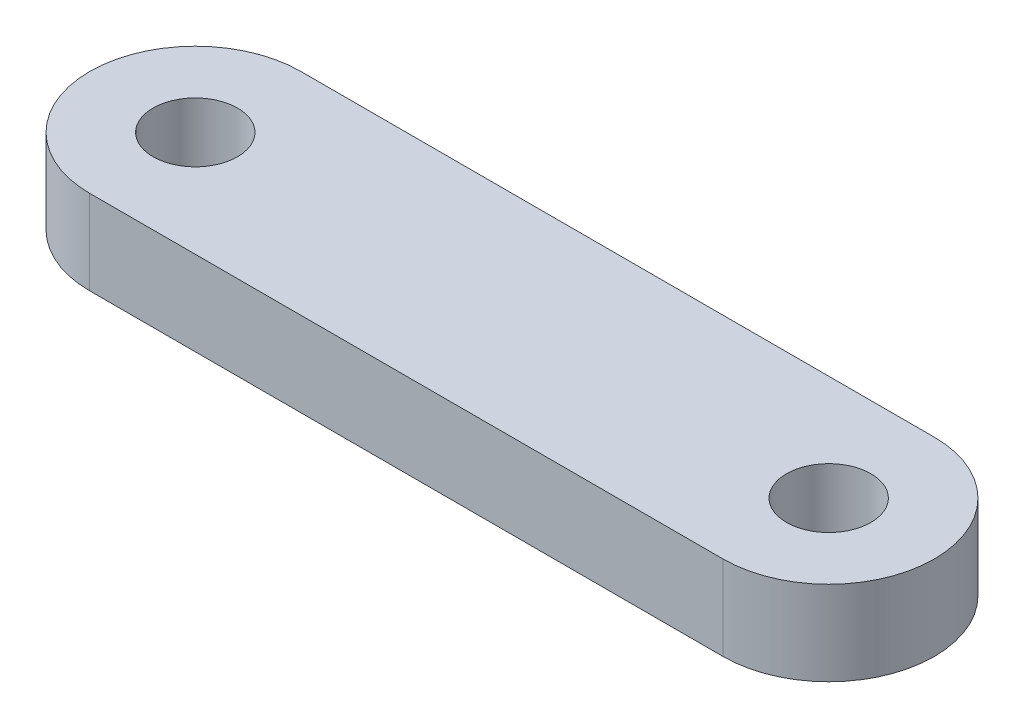
ISO-10303-21;
HEADER;
FILE_DESCRIPTION(('STEP AP214'),'2;1');
FILE_NAME('part.step','',(''),(''),'','','');
FILE_SCHEMA(('AUTOMOTIVE_DESIGN { 1 0 10303 214 1 1 1 1 }'));
ENDSEC;
DATA;
#1=APPLICATION_CONTEXT('core data for automotive mechanical design processes');
#2=APPLICATION_PROTOCOL_DEFINITION('international standard','automotive_design',2000,#1);
#3=PRODUCT_CONTEXT('',#1,'mechanical');
#4=PRODUCT('Part','Part','',(#3));
#5=PRODUCT_RELATED_PRODUCT_CATEGORY('part','',(#4));
#6=PRODUCT_DEFINITION_FORMATION('','',#4);
#7=PRODUCT_DEFINITION_CONTEXT('part definition',#1,'design');
#8=PRODUCT_DEFINITION('design','',#6,#7);
#9=PRODUCT_DEFINITION_SHAPE('','',#8);
#10=(LENGTH_UNIT() NAMED_UNIT(*) SI_UNIT(.MILLI.,.METRE.));
#11=(NAMED_UNIT(*) PLANE_ANGLE_UNIT() SI_UNIT($,.RADIAN.));
#12=(NAMED_UNIT(*) SI_UNIT($,.STERADIAN.) SOLID_ANGLE_UNIT());
#13=UNCERTAINTY_MEASURE_WITH_UNIT(LENGTH_MEASURE(1.E-05),#10,'distance_accuracy_value','');
#14=(GEOMETRIC_REPRESENTATION_CONTEXT(3) GLOBAL_UNCERTAINTY_ASSIGNED_CONTEXT((#13)) GLOBAL_UNIT_ASSIGNED_CONTEXT((#10,
#11,#12)) REPRESENTATION_CONTEXT('',''));
#15=CARTESIAN_POINT('',(0.,0.,0.));
#16=DIRECTION('',(0.,0.,1.));
#17=DIRECTION('',(1.,0.,0.));
#18=AXIS2_PLACEMENT_3D('',#15,#16,#17);
#19=CARTESIAN_POINT('',(-10.,2.,0.));
#20=DIRECTION('',(0.,1.,0.));
#21=DIRECTION('',(0.,0.,1.));
#22=AXIS2_PLACEMENT_3D('',#19,#20,#21);
#23=PLANE('',#22);
#24=CARTESIAN_POINT('',(5.,2.,0.));
#25=DIRECTION('',(0.,1.,0.));
#26=DIRECTION('',(0.,0.,1.));
#27=AXIS2_PLACEMENT_3D('',#24,#25,#26);
#28=CIRCLE('',#27,1.);
#29=CARTESIAN_POINT('',(5.,2.,1.));
#30=VERTEX_POINT('',#29);
#31=EDGE_CURVE('E104',#30,#30,#28,.T.);
#32=ORIENTED_EDGE('',*,*,#31,.F.);
#33=EDGE_LOOP('',(#32));
#34=FACE_BOUND('',#33,.T.);
#35=CARTESIAN_POINT('',(-10.,2.,0.));
#36=DIRECTION('',(0.,1.,0.));
#37=DIRECTION('',(0.,0.,1.));
#38=AXIS2_PLACEMENT_3D('',#35,#36,#37);
#39=CIRCLE('',#38,2.5);
#40=CARTESIAN_POINT('',(-10.,2.,-2.5));
#41=VERTEX_POINT('',#40);
#42=CARTESIAN_POINT('',(-10.,2.,2.5));
#43=VERTEX_POINT('',#42);
#44=EDGE_CURVE('E89',#41,#43,#39,.T.);
#45=ORIENTED_EDGE('',*,*,#44,.T.);
#46=DIRECTION('',(1.,0.,0.));
#47=VECTOR('',#46,1.);
#48=CARTESIAN_POINT('',(-10.,2.,2.5));
#49=LINE('',#48,#47);
#50=CARTESIAN_POINT('',(5.,2.,2.5));
#51=VERTEX_POINT('',#50);
#52=EDGE_CURVE('E84',#43,#51,#49,.T.);
#53=ORIENTED_EDGE('',*,*,#52,.T.);
#54=CARTESIAN_POINT('',(5.,2.,0.));
#55=DIRECTION('',(0.,1.,0.));
#56=DIRECTION('',(0.,0.,1.));
#57=AXIS2_PLACEMENT_3D('',#54,#55,#56);
#58=CIRCLE('',#57,2.5);
#59=CARTESIAN_POINT('',(5.,2.,-2.5));
#60=VERTEX_POINT('',#59);
#61=EDGE_CURVE('E87',#51,#60,#58,.T.);
#62=ORIENTED_EDGE('',*,*,#61,.T.);
#63=DIRECTION('',(-1.,0.,0.));
#64=VECTOR('',#63,1.);
#65=CARTESIAN_POINT('',(-10.,2.,-2.5));
#66=LINE('',#65,#64);
#67=EDGE_CURVE('E54',#60,#41,#66,.T.);
#68=ORIENTED_EDGE('',*,*,#67,.T.);
#69=EDGE_LOOP('',(#45,#53,#62,#68));
#70=FACE_BOUND('',#69,.T.);
#71=CARTESIAN_POINT('',(-10.,2.,0.));
#72=DIRECTION('',(0.,1.,0.));
#73=DIRECTION('',(0.,0.,1.));
#74=AXIS2_PLACEMENT_3D('',#71,#72,#73);
#75=CIRCLE('',#74,1.);
#76=CARTESIAN_POINT('',(-10.,2.,1.));
#77=VERTEX_POINT('',#76);
#78=EDGE_CURVE('E119',#77,#77,#75,.T.);
#79=ORIENTED_EDGE('',*,*,#78,.F.);
#80=EDGE_LOOP('',(#79));
#81=FACE_BOUND('',#80,.T.);
#82=ADVANCED_FACE('F37',(#34,#70,#81),#23,.T.);
#83=CARTESIAN_POINT('',(-10.,0.,0.));
#84=DIRECTION('',(0.,1.,0.));
#85=DIRECTION('',(0.,0.,1.));
#86=AXIS2_PLACEMENT_3D('',#83,#84,#85);
#87=PLANE('',#86);
#88=CARTESIAN_POINT('',(-10.,0.,0.));
#89=DIRECTION('',(0.,1.,0.));
#90=DIRECTION('',(0.,0.,1.));
#91=AXIS2_PLACEMENT_3D('',#88,#89,#90);
#92=CIRCLE('',#91,2.5);
#93=CARTESIAN_POINT('',(-10.,0.,-2.5));
#94=VERTEX_POINT('',#93);
#95=CARTESIAN_POINT('',(-10.,0.,2.5));
#96=VERTEX_POINT('',#95);
#97=EDGE_CURVE('E101',#94,#96,#92,.T.);
#98=ORIENTED_EDGE('',*,*,#97,.F.);
#99=DIRECTION('',(-1.,0.,0.));
#100=VECTOR('',#99,1.);
#101=CARTESIAN_POINT('',(-10.,0.,-2.5));
#102=LINE('',#101,#100);
#103=CARTESIAN_POINT('',(5.,0.,-2.5));
#104=VERTEX_POINT('',#103);
#105=EDGE_CURVE('E77',#104,#94,#102,.T.);
#106=ORIENTED_EDGE('',*,*,#105,.F.);
#107=CARTESIAN_POINT('',(5.,0.,0.));
#108=DIRECTION('',(0.,1.,0.));
#109=DIRECTION('',(0.,0.,1.));
#110=AXIS2_PLACEMENT_3D('',#107,#108,#109);
#111=CIRCLE('',#110,2.5);
#112=CARTESIAN_POINT('',(5.,0.,2.5));
#113=VERTEX_POINT('',#112);
#114=EDGE_CURVE('E71',#113,#104,#111,.T.);
#115=ORIENTED_EDGE('',*,*,#114,.F.);
#116=DIRECTION('',(1.,0.,0.));
#117=VECTOR('',#116,1.);
#118=CARTESIAN_POINT('',(-10.,0.,2.5));
#119=LINE('',#118,#117);
#120=EDGE_CURVE('E93',#96,#113,#119,.T.);
#121=ORIENTED_EDGE('',*,*,#120,.F.);
#122=EDGE_LOOP('',(#98,#106,#115,#121));
#123=FACE_BOUND('',#122,.T.);
#124=CARTESIAN_POINT('',(5.,0.,0.));
#125=DIRECTION('',(0.,1.,0.));
#126=DIRECTION('',(0.,0.,1.));
#127=AXIS2_PLACEMENT_3D('',#124,#125,#126);
#128=CIRCLE('',#127,1.);
#129=CARTESIAN_POINT('',(5.,0.,1.));
#130=VERTEX_POINT('',#129);
#131=EDGE_CURVE('E116',#130,#130,#128,.T.);
#132=ORIENTED_EDGE('',*,*,#131,.T.);
#133=EDGE_LOOP('',(#132));
#134=FACE_BOUND('',#133,.T.);
#135=CARTESIAN_POINT('',(-10.,0.,0.));
#136=DIRECTION('',(0.,1.,0.));
#137=DIRECTION('',(0.,0.,1.));
#138=AXIS2_PLACEMENT_3D('',#135,#136,#137);
#139=CIRCLE('',#138,1.);
#140=CARTESIAN_POINT('',(-10.,0.,1.));
#141=VERTEX_POINT('',#140);
#142=EDGE_CURVE('E122',#141,#141,#139,.T.);
#143=ORIENTED_EDGE('',*,*,#142,.T.);
#144=EDGE_LOOP('',(#143));
#145=FACE_BOUND('',#144,.T.);
#146=ADVANCED_FACE('F112',(#123,#134,#145),#87,.F.);
#147=CARTESIAN_POINT('',(-10.,2.,0.));
#148=DIRECTION('',(0.,-1.,0.));
#149=DIRECTION('',(0.,0.,-1.));
#150=AXIS2_PLACEMENT_3D('',#147,#148,#149);
#151=CYLINDRICAL_SURFACE('',#150,2.5);
#152=ORIENTED_EDGE('',*,*,#97,.T.);
#153=DIRECTION('',(0.,-1.,0.));
#154=VECTOR('',#153,1.);
#155=CARTESIAN_POINT('',(-10.,2.,2.5));
#156=LINE('',#155,#154);
#157=EDGE_CURVE('E11',#43,#96,#156,.T.);
#158=ORIENTED_EDGE('',*,*,#157,.F.);
#159=ORIENTED_EDGE('',*,*,#44,.F.);
#160=DIRECTION('',(0.,-1.,0.));
#161=VECTOR('',#160,1.);
#162=CARTESIAN_POINT('',(-10.,2.,-2.5));
#163=LINE('',#162,#161);
#164=EDGE_CURVE('E97',#41,#94,#163,.T.);
#165=ORIENTED_EDGE('',*,*,#164,.T.);
#166=EDGE_LOOP('',(#152,#158,#159,#165));
#167=FACE_BOUND('',#166,.T.);
#168=ADVANCED_FACE('F39',(#167),#151,.T.);
#169=CARTESIAN_POINT('',(-10.,2.,2.5));
#170=DIRECTION('',(0.,0.,-1.));
#171=DIRECTION('',(-1.,0.,0.));
#172=AXIS2_PLACEMENT_3D('',#169,#170,#171);
#173=PLANE('',#172);
#174=ORIENTED_EDGE('',*,*,#120,.T.);
#175=DIRECTION('',(0.,-1.,0.));
#176=VECTOR('',#175,1.);
#177=CARTESIAN_POINT('',(5.,2.,2.5));
#178=LINE('',#177,#176);
#179=EDGE_CURVE('E46',#51,#113,#178,.T.);
#180=ORIENTED_EDGE('',*,*,#179,.F.);
#181=ORIENTED_EDGE('',*,*,#52,.F.);
#182=ORIENTED_EDGE('',*,*,#157,.T.);
#183=EDGE_LOOP('',(#174,#180,#181,#182));
#184=FACE_BOUND('',#183,.T.);
#185=ADVANCED_FACE('F92',(#184),#173,.F.);
#186=CARTESIAN_POINT('',(5.,2.,0.));
#187=DIRECTION('',(0.,-1.,0.));
#188=DIRECTION('',(0.,0.,-1.));
#189=AXIS2_PLACEMENT_3D('',#186,#187,#188);
#190=CYLINDRICAL_SURFACE('',#189,2.5);
#191=ORIENTED_EDGE('',*,*,#114,.T.);
#192=DIRECTION('',(0.,-1.,0.));
#193=VECTOR('',#192,1.);
#194=CARTESIAN_POINT('',(5.,2.,-2.5));
#195=LINE('',#194,#193);
#196=EDGE_CURVE('E94',#60,#104,#195,.T.);
#197=ORIENTED_EDGE('',*,*,#196,.F.);
#198=ORIENTED_EDGE('',*,*,#61,.F.);
#199=ORIENTED_EDGE('',*,*,#179,.T.);
#200=EDGE_LOOP('',(#191,#197,#198,#199));
#201=FACE_BOUND('',#200,.T.);
#202=ADVANCED_FACE('F95',(#201),#190,.T.);
#203=CARTESIAN_POINT('',(-10.,2.,-2.5));
#204=DIRECTION('',(0.,0.,1.));
#205=DIRECTION('',(1.,0.,0.));
#206=AXIS2_PLACEMENT_3D('',#203,#204,#205);
#207=PLANE('',#206);
#208=ORIENTED_EDGE('',*,*,#105,.T.);
#209=ORIENTED_EDGE('',*,*,#164,.F.);
#210=ORIENTED_EDGE('',*,*,#67,.F.);
#211=ORIENTED_EDGE('',*,*,#196,.T.);
#212=EDGE_LOOP('',(#208,#209,#210,#211));
#213=FACE_BOUND('',#212,.T.);
#214=ADVANCED_FACE('F109',(#213),#207,.F.);
#215=CARTESIAN_POINT('',(5.,2.,0.));
#216=DIRECTION('',(0.,-1.,0.));
#217=DIRECTION('',(0.,0.,-1.));
#218=AXIS2_PLACEMENT_3D('',#215,#216,#217);
#219=CYLINDRICAL_SURFACE('',#218,1.);
#220=ORIENTED_EDGE('',*,*,#31,.T.);
#221=EDGE_LOOP('',(#220));
#222=FACE_BOUND('',#221,.T.);
#223=ORIENTED_EDGE('',*,*,#131,.F.);
#224=EDGE_LOOP('',(#223));
#225=FACE_BOUND('',#224,.T.);
#226=ADVANCED_FACE('F139',(#222,#225),#219,.F.);
#227=CARTESIAN_POINT('',(-10.,2.,0.));
#228=DIRECTION('',(0.,-1.,0.));
#229=DIRECTION('',(0.,0.,-1.));
#230=AXIS2_PLACEMENT_3D('',#227,#228,#229);
#231=CYLINDRICAL_SURFACE('',#230,1.);
#232=ORIENTED_EDGE('',*,*,#78,.T.);
#233=EDGE_LOOP('',(#232));
#234=FACE_BOUND('',#233,.T.);
#235=ORIENTED_EDGE('',*,*,#142,.F.);
#236=EDGE_LOOP('',(#235));
#237=FACE_BOUND('',#236,.T.);
#238=ADVANCED_FACE('F128',(#234,#237),#231,.F.);
#239=CLOSED_SHELL('',(#82,#146,#168,#185,#202,#214,#226,#238));
#240=MANIFOLD_SOLID_BREP('B2',#239);
#241=ADVANCED_BREP_SHAPE_REPRESENTATION('',(#18,#240),#14);
#242=SHAPE_DEFINITION_REPRESENTATION(#9,#241);
ENDSEC;
END-ISO-10303-21;
